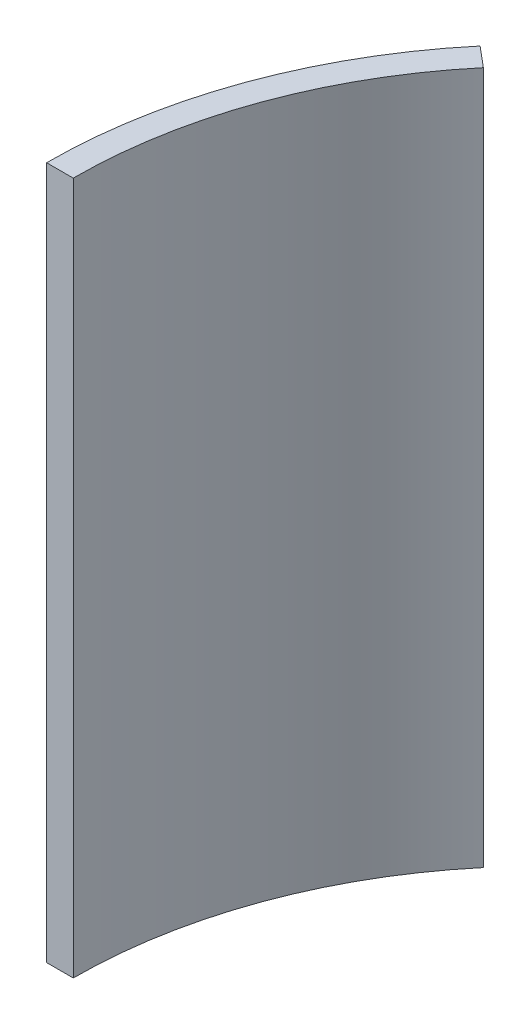
ISO-10303-21;
HEADER;
FILE_DESCRIPTION(('STEP AP214'),'2;1');
FILE_NAME('part.step','',(''),(''),'','','');
FILE_SCHEMA(('AUTOMOTIVE_DESIGN { 1 0 10303 214 1 1 1 1 }'));
ENDSEC;
DATA;
#1=APPLICATION_CONTEXT('core data for automotive mechanical design processes');
#2=APPLICATION_PROTOCOL_DEFINITION('international standard','automotive_design',2000,#1);
#3=PRODUCT_CONTEXT('',#1,'mechanical');
#4=PRODUCT('Part','Part','',(#3));
#5=PRODUCT_RELATED_PRODUCT_CATEGORY('part','',(#4));
#6=PRODUCT_DEFINITION_FORMATION('','',#4);
#7=PRODUCT_DEFINITION_CONTEXT('part definition',#1,'design');
#8=PRODUCT_DEFINITION('design','',#6,#7);
#9=PRODUCT_DEFINITION_SHAPE('','',#8);
#10=(LENGTH_UNIT() NAMED_UNIT(*) SI_UNIT(.MILLI.,.METRE.));
#11=(NAMED_UNIT(*) PLANE_ANGLE_UNIT() SI_UNIT($,.RADIAN.));
#12=(NAMED_UNIT(*) SI_UNIT($,.STERADIAN.) SOLID_ANGLE_UNIT());
#13=UNCERTAINTY_MEASURE_WITH_UNIT(LENGTH_MEASURE(1.E-05),#10,'distance_accuracy_value','');
#14=(GEOMETRIC_REPRESENTATION_CONTEXT(3) GLOBAL_UNCERTAINTY_ASSIGNED_CONTEXT((#13)) GLOBAL_UNIT_ASSIGNED_CONTEXT((#10,
#11,#12)) REPRESENTATION_CONTEXT('',''));
#15=CARTESIAN_POINT('',(0.,0.,0.));
#16=DIRECTION('',(0.,0.,1.));
#17=DIRECTION('',(1.,0.,0.));
#18=AXIS2_PLACEMENT_3D('',#15,#16,#17);
#19=CARTESIAN_POINT('',(77.7861913430201,150.,0.));
#20=DIRECTION('',(0.,-1.,0.));
#21=DIRECTION('',(0.,0.,-1.));
#22=AXIS2_PLACEMENT_3D('',#19,#20,#21);
#23=CYLINDRICAL_SURFACE('',#22,87.7861913430201);
#24=CARTESIAN_POINT('',(77.7861913430201,20.,0.));
#25=DIRECTION('',(0.,-1.,0.));
#26=DIRECTION('',(0.,0.,1.));
#27=AXIS2_PLACEMENT_3D('',#24,#25,#26);
#28=CIRCLE('',#27,87.7861913430201);
#29=CARTESIAN_POINT('',(-9.99999999999999,20.,0.));
#30=VERTEX_POINT('',#29);
#31=CARTESIAN_POINT('',(10.5380672821205,20.,-56.4278760968654));
#32=VERTEX_POINT('',#31);
#33=EDGE_CURVE('E96',#30,#32,#28,.T.);
#34=ORIENTED_EDGE('',*,*,#33,.T.);
#35=DIRECTION('',(0.,-1.,0.));
#36=VECTOR('',#35,1.);
#37=CARTESIAN_POINT('',(10.5380672821205,150.,-56.4278760968654));
#38=LINE('',#37,#36);
#39=CARTESIAN_POINT('',(10.5380672821205,150.,-56.4278760968654));
#40=VERTEX_POINT('',#39);
#41=EDGE_CURVE('E11',#40,#32,#38,.T.);
#42=ORIENTED_EDGE('',*,*,#41,.F.);
#43=CARTESIAN_POINT('',(77.7861913430201,150.,0.));
#44=DIRECTION('',(0.,-1.,0.));
#45=DIRECTION('',(0.,0.,1.));
#46=AXIS2_PLACEMENT_3D('',#43,#44,#45);
#47=CIRCLE('',#46,87.7861913430201);
#48=CARTESIAN_POINT('',(-9.99999999999999,150.,0.));
#49=VERTEX_POINT('',#48);
#50=EDGE_CURVE('E84',#49,#40,#47,.T.);
#51=ORIENTED_EDGE('',*,*,#50,.F.);
#52=DIRECTION('',(0.,-1.,0.));
#53=VECTOR('',#52,1.);
#54=CARTESIAN_POINT('',(-9.99999999999999,150.,0.));
#55=LINE('',#54,#53);
#56=EDGE_CURVE('E92',#49,#30,#55,.T.);
#57=ORIENTED_EDGE('',*,*,#56,.T.);
#58=EDGE_LOOP('',(#34,#42,#51,#57));
#59=FACE_BOUND('',#58,.T.);
#60=ADVANCED_FACE('F33',(#59),#23,.F.);
#61=CARTESIAN_POINT('',(6.70784506652562,150.,-59.6418141452981));
#62=DIRECTION('',(-0.64278760968654,0.,0.766044443118977));
#63=DIRECTION('',(0.766044443118978,0.,0.64278760968654));
#64=AXIS2_PLACEMENT_3D('',#61,#62,#63);
#65=PLANE('',#64);
#66=DIRECTION('',(-0.766044443118977,0.,-0.64278760968654));
#67=VECTOR('',#66,1.);
#68=CARTESIAN_POINT('',(6.70784506652562,20.,-59.6418141452981));
#69=LINE('',#68,#67);
#70=CARTESIAN_POINT('',(6.70784506652562,20.,-59.6418141452981));
#71=VERTEX_POINT('',#70);
#72=EDGE_CURVE('E88',#32,#71,#69,.T.);
#73=ORIENTED_EDGE('',*,*,#72,.T.);
#74=DIRECTION('',(0.,-1.,0.));
#75=VECTOR('',#74,1.);
#76=CARTESIAN_POINT('',(6.70784506652562,150.,-59.6418141452981));
#77=LINE('',#76,#75);
#78=CARTESIAN_POINT('',(6.70784506652562,150.,-59.6418141452981));
#79=VERTEX_POINT('',#78);
#80=EDGE_CURVE('E41',#79,#71,#77,.T.);
#81=ORIENTED_EDGE('',*,*,#80,.F.);
#82=DIRECTION('',(-0.766044443118977,0.,-0.64278760968654));
#83=VECTOR('',#82,1.);
#84=CARTESIAN_POINT('',(6.70784506652562,150.,-59.6418141452981));
#85=LINE('',#84,#83);
#86=EDGE_CURVE('E79',#40,#79,#85,.T.);
#87=ORIENTED_EDGE('',*,*,#86,.F.);
#88=ORIENTED_EDGE('',*,*,#41,.T.);
#89=EDGE_LOOP('',(#73,#81,#87,#88));
#90=FACE_BOUND('',#89,.T.);
#91=ADVANCED_FACE('F87',(#90),#65,.F.);
#92=CARTESIAN_POINT('',(77.7861913430201,150.,0.));
#93=DIRECTION('',(0.,-1.,0.));
#94=DIRECTION('',(0.,0.,-1.));
#95=AXIS2_PLACEMENT_3D('',#92,#93,#94);
#96=CYLINDRICAL_SURFACE('',#95,92.7861913430201);
#97=CARTESIAN_POINT('',(77.7861913430201,20.,0.));
#98=DIRECTION('',(0.,1.,0.));
#99=DIRECTION('',(0.,0.,1.));
#100=AXIS2_PLACEMENT_3D('',#97,#98,#99);
#101=CIRCLE('',#100,92.7861913430201);
#102=CARTESIAN_POINT('',(-15.,20.,0.));
#103=VERTEX_POINT('',#102);
#104=EDGE_CURVE('E66',#71,#103,#101,.T.);
#105=ORIENTED_EDGE('',*,*,#104,.T.);
#106=DIRECTION('',(0.,-1.,0.));
#107=VECTOR('',#106,1.);
#108=CARTESIAN_POINT('',(-15.,150.,0.));
#109=LINE('',#108,#107);
#110=CARTESIAN_POINT('',(-15.,150.,0.));
#111=VERTEX_POINT('',#110);
#112=EDGE_CURVE('E89',#111,#103,#109,.T.);
#113=ORIENTED_EDGE('',*,*,#112,.F.);
#114=CARTESIAN_POINT('',(77.7861913430201,150.,0.));
#115=DIRECTION('',(0.,1.,0.));
#116=DIRECTION('',(0.,0.,1.));
#117=AXIS2_PLACEMENT_3D('',#114,#115,#116);
#118=CIRCLE('',#117,92.7861913430201);
#119=EDGE_CURVE('E82',#79,#111,#118,.T.);
#120=ORIENTED_EDGE('',*,*,#119,.F.);
#121=ORIENTED_EDGE('',*,*,#80,.T.);
#122=EDGE_LOOP('',(#105,#113,#120,#121));
#123=FACE_BOUND('',#122,.T.);
#124=ADVANCED_FACE('F90',(#123),#96,.T.);
#125=CARTESIAN_POINT('',(-15.,150.,0.));
#126=DIRECTION('',(0.,0.,-1.));
#127=DIRECTION('',(-1.,0.,0.));
#128=AXIS2_PLACEMENT_3D('',#125,#126,#127);
#129=PLANE('',#128);
#130=DIRECTION('',(1.,0.,0.));
#131=VECTOR('',#130,1.);
#132=CARTESIAN_POINT('',(-15.,20.,0.));
#133=LINE('',#132,#131);
#134=EDGE_CURVE('E72',#103,#30,#133,.T.);
#135=ORIENTED_EDGE('',*,*,#134,.T.);
#136=ORIENTED_EDGE('',*,*,#56,.F.);
#137=DIRECTION('',(1.,0.,0.));
#138=VECTOR('',#137,1.);
#139=CARTESIAN_POINT('',(-15.,150.,0.));
#140=LINE('',#139,#138);
#141=EDGE_CURVE('E49',#111,#49,#140,.T.);
#142=ORIENTED_EDGE('',*,*,#141,.F.);
#143=ORIENTED_EDGE('',*,*,#112,.T.);
#144=EDGE_LOOP('',(#135,#136,#142,#143));
#145=FACE_BOUND('',#144,.T.);
#146=ADVANCED_FACE('F103',(#145),#129,.F.);
#147=CARTESIAN_POINT('',(77.7861913430201,150.,0.));
#148=DIRECTION('',(0.,1.,0.));
#149=DIRECTION('',(0.,0.,1.));
#150=AXIS2_PLACEMENT_3D('',#147,#148,#149);
#151=PLANE('',#150);
#152=ORIENTED_EDGE('',*,*,#50,.T.);
#153=ORIENTED_EDGE('',*,*,#86,.T.);
#154=ORIENTED_EDGE('',*,*,#119,.T.);
#155=ORIENTED_EDGE('',*,*,#141,.T.);
#156=EDGE_LOOP('',(#152,#153,#154,#155));
#157=FACE_BOUND('',#156,.T.);
#158=ADVANCED_FACE('F80',(#157),#151,.T.);
#159=CARTESIAN_POINT('',(77.7861913430201,20.,0.));
#160=DIRECTION('',(0.,1.,0.));
#161=DIRECTION('',(0.,0.,1.));
#162=AXIS2_PLACEMENT_3D('',#159,#160,#161);
#163=PLANE('',#162);
#164=ORIENTED_EDGE('',*,*,#33,.F.);
#165=ORIENTED_EDGE('',*,*,#134,.F.);
#166=ORIENTED_EDGE('',*,*,#104,.F.);
#167=ORIENTED_EDGE('',*,*,#72,.F.);
#168=EDGE_LOOP('',(#164,#165,#166,#167));
#169=FACE_BOUND('',#168,.T.);
#170=ADVANCED_FACE('F106',(#169),#163,.F.);
#171=CLOSED_SHELL('',(#60,#91,#124,#146,#158,#170));
#172=MANIFOLD_SOLID_BREP('B2',#171);
#173=ADVANCED_BREP_SHAPE_REPRESENTATION('',(#18,#172),#14);
#174=SHAPE_DEFINITION_REPRESENTATION(#9,#173);
ENDSEC;
END-ISO-10303-21;
